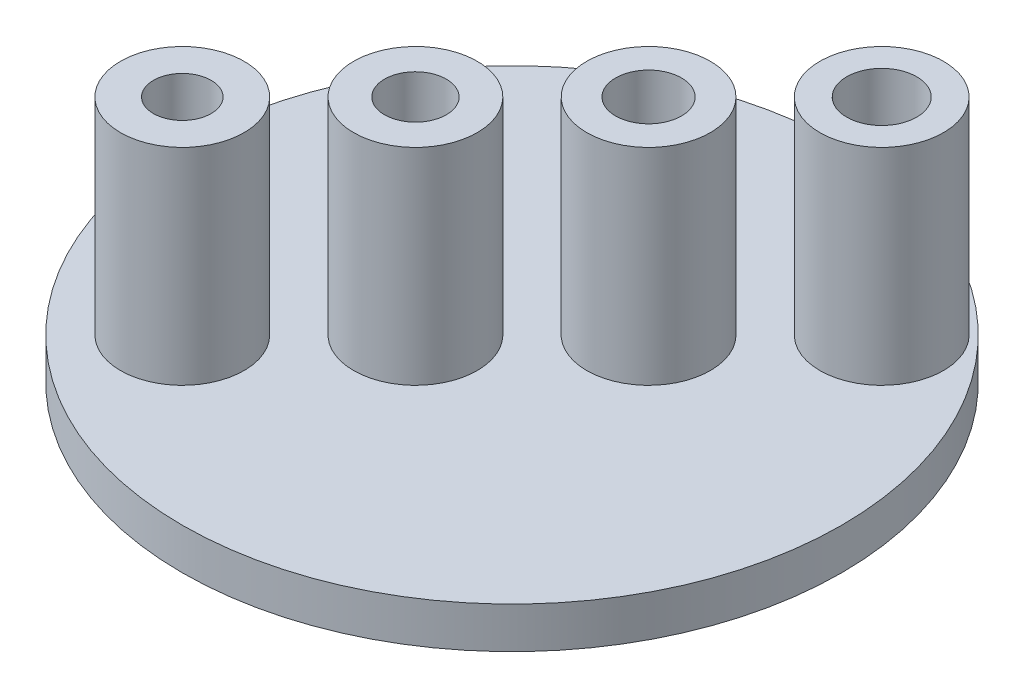
ISO-10303-21;
HEADER;
FILE_DESCRIPTION(('STEP AP214'),'2;1');
FILE_NAME('part.step','',(''),(''),'','','');
FILE_SCHEMA(('AUTOMOTIVE_DESIGN { 1 0 10303 214 1 1 1 1 }'));
ENDSEC;
DATA;
#1=APPLICATION_CONTEXT('core data for automotive mechanical design processes');
#2=APPLICATION_PROTOCOL_DEFINITION('international standard','automotive_design',2000,#1);
#3=PRODUCT_CONTEXT('',#1,'mechanical');
#4=PRODUCT('Part','Part','',(#3));
#5=PRODUCT_RELATED_PRODUCT_CATEGORY('part','',(#4));
#6=PRODUCT_DEFINITION_FORMATION('','',#4);
#7=PRODUCT_DEFINITION_CONTEXT('part definition',#1,'design');
#8=PRODUCT_DEFINITION('design','',#6,#7);
#9=PRODUCT_DEFINITION_SHAPE('','',#8);
#10=(LENGTH_UNIT() NAMED_UNIT(*) SI_UNIT(.MILLI.,.METRE.));
#11=(NAMED_UNIT(*) PLANE_ANGLE_UNIT() SI_UNIT($,.RADIAN.));
#12=(NAMED_UNIT(*) SI_UNIT($,.STERADIAN.) SOLID_ANGLE_UNIT());
#13=UNCERTAINTY_MEASURE_WITH_UNIT(LENGTH_MEASURE(1.E-05),#10,'distance_accuracy_value','');
#14=(GEOMETRIC_REPRESENTATION_CONTEXT(3) GLOBAL_UNCERTAINTY_ASSIGNED_CONTEXT((#13)) GLOBAL_UNIT_ASSIGNED_CONTEXT((#10,
#11,#12)) REPRESENTATION_CONTEXT('',''));
#15=CARTESIAN_POINT('',(0.,0.,0.));
#16=DIRECTION('',(0.,0.,1.));
#17=DIRECTION('',(1.,0.,0.));
#18=AXIS2_PLACEMENT_3D('',#15,#16,#17);
#19=CARTESIAN_POINT('',(0.,1.27,0.));
#20=DIRECTION('',(0.,-1.,0.));
#21=DIRECTION('',(0.,0.,-1.));
#22=AXIS2_PLACEMENT_3D('',#19,#20,#21);
#23=CYLINDRICAL_SURFACE('',#22,10.16);
#24=CARTESIAN_POINT('',(0.,1.27,0.));
#25=DIRECTION('',(0.,1.,0.));
#26=DIRECTION('',(0.,0.,1.));
#27=AXIS2_PLACEMENT_3D('',#24,#25,#26);
#28=CIRCLE('',#27,10.16);
#29=CARTESIAN_POINT('',(0.,1.27,10.16));
#30=VERTEX_POINT('',#29);
#31=EDGE_CURVE('E10',#30,#30,#28,.T.);
#32=ORIENTED_EDGE('',*,*,#31,.F.);
#33=EDGE_LOOP('',(#32));
#34=FACE_BOUND('',#33,.T.);
#35=CARTESIAN_POINT('',(0.,0.,0.));
#36=DIRECTION('',(0.,1.,0.));
#37=DIRECTION('',(0.,0.,1.));
#38=AXIS2_PLACEMENT_3D('',#35,#36,#37);
#39=CIRCLE('',#38,10.16);
#40=CARTESIAN_POINT('',(0.,0.,10.16));
#41=VERTEX_POINT('',#40);
#42=EDGE_CURVE('E42',#41,#41,#39,.T.);
#43=ORIENTED_EDGE('',*,*,#42,.T.);
#44=EDGE_LOOP('',(#43));
#45=FACE_BOUND('',#44,.T.);
#46=ADVANCED_FACE('F39',(#34,#45),#23,.T.);
#47=CARTESIAN_POINT('',(0.,1.27,0.));
#48=DIRECTION('',(0.,1.,0.));
#49=DIRECTION('',(0.,0.,1.));
#50=AXIS2_PLACEMENT_3D('',#47,#48,#49);
#51=PLANE('',#50);
#52=CARTESIAN_POINT('',(5.69630734528298,1.27,-5.69630734528298));
#53=DIRECTION('',(0.,1.,0.));
#54=DIRECTION('',(0.,0.,1.));
#55=AXIS2_PLACEMENT_3D('',#52,#53,#54);
#56=CIRCLE('',#55,1.905);
#57=CARTESIAN_POINT('',(5.69630734528298,1.27,-3.79130734528299));
#58=VERTEX_POINT('',#57);
#59=EDGE_CURVE('E69',#58,#58,#56,.T.);
#60=ORIENTED_EDGE('',*,*,#59,.F.);
#61=EDGE_LOOP('',(#60));
#62=FACE_BOUND('',#61,.T.);
#63=CARTESIAN_POINT('',(2.10420489685532,1.27,-2.10420489685532));
#64=DIRECTION('',(0.,1.,0.));
#65=DIRECTION('',(0.,0.,1.));
#66=AXIS2_PLACEMENT_3D('',#63,#64,#65);
#67=CIRCLE('',#66,1.905);
#68=CARTESIAN_POINT('',(2.10420489685532,1.27,-0.199204896855324));
#69=VERTEX_POINT('',#68);
#70=EDGE_CURVE('E63',#69,#69,#67,.T.);
#71=ORIENTED_EDGE('',*,*,#70,.F.);
#72=EDGE_LOOP('',(#71));
#73=FACE_BOUND('',#72,.T.);
#74=CARTESIAN_POINT('',(-1.48789755157234,1.27,1.48789755157234));
#75=DIRECTION('',(0.,1.,0.));
#76=DIRECTION('',(0.,0.,1.));
#77=AXIS2_PLACEMENT_3D('',#74,#75,#76);
#78=CIRCLE('',#77,1.905);
#79=CARTESIAN_POINT('',(-1.48789755157234,1.27,3.39289755157234));
#80=VERTEX_POINT('',#79);
#81=EDGE_CURVE('E57',#80,#80,#78,.T.);
#82=ORIENTED_EDGE('',*,*,#81,.F.);
#83=EDGE_LOOP('',(#82));
#84=FACE_BOUND('',#83,.T.);
#85=CARTESIAN_POINT('',(-5.08,1.27,5.08));
#86=DIRECTION('',(0.,1.,0.));
#87=DIRECTION('',(0.,0.,1.));
#88=AXIS2_PLACEMENT_3D('',#85,#86,#87);
#89=CIRCLE('',#88,1.905);
#90=CARTESIAN_POINT('',(-5.08,1.27,6.985));
#91=VERTEX_POINT('',#90);
#92=EDGE_CURVE('E51',#91,#91,#89,.T.);
#93=ORIENTED_EDGE('',*,*,#92,.F.);
#94=EDGE_LOOP('',(#93));
#95=FACE_BOUND('',#94,.T.);
#96=ORIENTED_EDGE('',*,*,#31,.T.);
#97=EDGE_LOOP('',(#96));
#98=FACE_BOUND('',#97,.T.);
#99=ADVANCED_FACE('F115',(#62,#73,#84,#95,#98),#51,.T.);
#100=CARTESIAN_POINT('',(0.,0.,0.));
#101=DIRECTION('',(0.,1.,0.));
#102=DIRECTION('',(0.,0.,1.));
#103=AXIS2_PLACEMENT_3D('',#100,#101,#102);
#104=PLANE('',#103);
#105=ORIENTED_EDGE('',*,*,#42,.F.);
#106=EDGE_LOOP('',(#105));
#107=FACE_BOUND('',#106,.T.);
#108=ADVANCED_FACE('F118',(#107),#104,.F.);
#109=CARTESIAN_POINT('',(-5.08,7.62,5.08));
#110=DIRECTION('',(0.,-1.,0.));
#111=DIRECTION('',(0.,0.,-1.));
#112=AXIS2_PLACEMENT_3D('',#109,#110,#111);
#113=CYLINDRICAL_SURFACE('',#112,1.905);
#114=CARTESIAN_POINT('',(-5.08,7.62,5.08));
#115=DIRECTION('',(0.,1.,0.));
#116=DIRECTION('',(0.,0.,1.));
#117=AXIS2_PLACEMENT_3D('',#114,#115,#116);
#118=CIRCLE('',#117,1.905);
#119=CARTESIAN_POINT('',(-5.08,7.62,6.985));
#120=VERTEX_POINT('',#119);
#121=EDGE_CURVE('E49',#120,#120,#118,.T.);
#122=ORIENTED_EDGE('',*,*,#121,.F.);
#123=EDGE_LOOP('',(#122));
#124=FACE_BOUND('',#123,.T.);
#125=ORIENTED_EDGE('',*,*,#92,.T.);
#126=EDGE_LOOP('',(#125));
#127=FACE_BOUND('',#126,.T.);
#128=ADVANCED_FACE('F126',(#124,#127),#113,.T.);
#129=CARTESIAN_POINT('',(-5.08,7.62,5.08));
#130=DIRECTION('',(0.,1.,0.));
#131=DIRECTION('',(0.,0.,1.));
#132=AXIS2_PLACEMENT_3D('',#129,#130,#131);
#133=PLANE('',#132);
#134=CARTESIAN_POINT('',(-5.08,7.62,5.08));
#135=DIRECTION('',(0.,1.,0.));
#136=DIRECTION('',(0.,0.,1.));
#137=AXIS2_PLACEMENT_3D('',#134,#135,#136);
#138=CIRCLE('',#137,0.889);
#139=CARTESIAN_POINT('',(-5.08,7.62,5.969));
#140=VERTEX_POINT('',#139);
#141=EDGE_CURVE('E77',#140,#140,#138,.T.);
#142=ORIENTED_EDGE('',*,*,#141,.F.);
#143=EDGE_LOOP('',(#142));
#144=FACE_BOUND('',#143,.T.);
#145=ORIENTED_EDGE('',*,*,#121,.T.);
#146=EDGE_LOOP('',(#145));
#147=FACE_BOUND('',#146,.T.);
#148=ADVANCED_FACE('F128',(#144,#147),#133,.T.);
#149=CARTESIAN_POINT('',(-1.48789755157234,7.62,1.48789755157234));
#150=DIRECTION('',(0.,-1.,0.));
#151=DIRECTION('',(0.,0.,-1.));
#152=AXIS2_PLACEMENT_3D('',#149,#150,#151);
#153=CYLINDRICAL_SURFACE('',#152,1.905);
#154=CARTESIAN_POINT('',(-1.48789755157234,7.62,1.48789755157234));
#155=DIRECTION('',(0.,1.,0.));
#156=DIRECTION('',(0.,0.,1.));
#157=AXIS2_PLACEMENT_3D('',#154,#155,#156);
#158=CIRCLE('',#157,1.905);
#159=CARTESIAN_POINT('',(-1.48789755157234,7.62,3.39289755157234));
#160=VERTEX_POINT('',#159);
#161=EDGE_CURVE('E54',#160,#160,#158,.T.);
#162=ORIENTED_EDGE('',*,*,#161,.F.);
#163=EDGE_LOOP('',(#162));
#164=FACE_BOUND('',#163,.T.);
#165=ORIENTED_EDGE('',*,*,#81,.T.);
#166=EDGE_LOOP('',(#165));
#167=FACE_BOUND('',#166,.T.);
#168=ADVANCED_FACE('F135',(#164,#167),#153,.T.);
#169=CARTESIAN_POINT('',(-1.48789755157234,7.62,1.48789755157234));
#170=DIRECTION('',(0.,1.,0.));
#171=DIRECTION('',(0.,0.,1.));
#172=AXIS2_PLACEMENT_3D('',#169,#170,#171);
#173=PLANE('',#172);
#174=CARTESIAN_POINT('',(-1.48789755157234,7.62,1.48789755157234));
#175=DIRECTION('',(0.,1.,0.));
#176=DIRECTION('',(0.,0.,1.));
#177=AXIS2_PLACEMENT_3D('',#174,#175,#176);
#178=CIRCLE('',#177,0.9525);
#179=CARTESIAN_POINT('',(-1.48789755157234,7.62,2.44039755157234));
#180=VERTEX_POINT('',#179);
#181=EDGE_CURVE('E83',#180,#180,#178,.T.);
#182=ORIENTED_EDGE('',*,*,#181,.F.);
#183=EDGE_LOOP('',(#182));
#184=FACE_BOUND('',#183,.T.);
#185=ORIENTED_EDGE('',*,*,#161,.T.);
#186=EDGE_LOOP('',(#185));
#187=FACE_BOUND('',#186,.T.);
#188=ADVANCED_FACE('F176',(#184,#187),#173,.T.);
#189=CARTESIAN_POINT('',(2.10420489685532,7.62,-2.10420489685532));
#190=DIRECTION('',(0.,-1.,0.));
#191=DIRECTION('',(0.,0.,-1.));
#192=AXIS2_PLACEMENT_3D('',#189,#190,#191);
#193=CYLINDRICAL_SURFACE('',#192,1.905);
#194=CARTESIAN_POINT('',(2.10420489685532,7.62,-2.10420489685532));
#195=DIRECTION('',(0.,1.,0.));
#196=DIRECTION('',(0.,0.,1.));
#197=AXIS2_PLACEMENT_3D('',#194,#195,#196);
#198=CIRCLE('',#197,1.905);
#199=CARTESIAN_POINT('',(2.10420489685532,7.62,-0.199204896855324));
#200=VERTEX_POINT('',#199);
#201=EDGE_CURVE('E60',#200,#200,#198,.T.);
#202=ORIENTED_EDGE('',*,*,#201,.F.);
#203=EDGE_LOOP('',(#202));
#204=FACE_BOUND('',#203,.T.);
#205=ORIENTED_EDGE('',*,*,#70,.T.);
#206=EDGE_LOOP('',(#205));
#207=FACE_BOUND('',#206,.T.);
#208=ADVANCED_FACE('F187',(#204,#207),#193,.T.);
#209=CARTESIAN_POINT('',(2.10420489685532,7.62,-2.10420489685532));
#210=DIRECTION('',(0.,1.,0.));
#211=DIRECTION('',(0.,0.,1.));
#212=AXIS2_PLACEMENT_3D('',#209,#210,#211);
#213=PLANE('',#212);
#214=CARTESIAN_POINT('',(2.10420489685532,7.62,-2.10420489685532));
#215=DIRECTION('',(0.,1.,0.));
#216=DIRECTION('',(0.,0.,1.));
#217=AXIS2_PLACEMENT_3D('',#214,#215,#216);
#218=CIRCLE('',#217,1.016);
#219=CARTESIAN_POINT('',(2.10420489685532,7.62,-1.08820489685532));
#220=VERTEX_POINT('',#219);
#221=EDGE_CURVE('E89',#220,#220,#218,.T.);
#222=ORIENTED_EDGE('',*,*,#221,.F.);
#223=EDGE_LOOP('',(#222));
#224=FACE_BOUND('',#223,.T.);
#225=ORIENTED_EDGE('',*,*,#201,.T.);
#226=EDGE_LOOP('',(#225));
#227=FACE_BOUND('',#226,.T.);
#228=ADVANCED_FACE('F111',(#224,#227),#213,.T.);
#229=CARTESIAN_POINT('',(5.69630734528298,7.62,-5.69630734528298));
#230=DIRECTION('',(0.,-1.,0.));
#231=DIRECTION('',(0.,0.,-1.));
#232=AXIS2_PLACEMENT_3D('',#229,#230,#231);
#233=CYLINDRICAL_SURFACE('',#232,1.905);
#234=CARTESIAN_POINT('',(5.69630734528298,7.62,-5.69630734528298));
#235=DIRECTION('',(0.,1.,0.));
#236=DIRECTION('',(0.,0.,1.));
#237=AXIS2_PLACEMENT_3D('',#234,#235,#236);
#238=CIRCLE('',#237,1.905);
#239=CARTESIAN_POINT('',(5.69630734528298,7.62,-3.79130734528299));
#240=VERTEX_POINT('',#239);
#241=EDGE_CURVE('E66',#240,#240,#238,.T.);
#242=ORIENTED_EDGE('',*,*,#241,.F.);
#243=EDGE_LOOP('',(#242));
#244=FACE_BOUND('',#243,.T.);
#245=ORIENTED_EDGE('',*,*,#59,.T.);
#246=EDGE_LOOP('',(#245));
#247=FACE_BOUND('',#246,.T.);
#248=ADVANCED_FACE('F105',(#244,#247),#233,.T.);
#249=CARTESIAN_POINT('',(5.69630734528298,7.62,-5.69630734528298));
#250=DIRECTION('',(0.,1.,0.));
#251=DIRECTION('',(0.,0.,1.));
#252=AXIS2_PLACEMENT_3D('',#249,#250,#251);
#253=PLANE('',#252);
#254=CARTESIAN_POINT('',(5.69630734528298,7.62,-5.69630734528298));
#255=DIRECTION('',(0.,1.,0.));
#256=DIRECTION('',(0.,0.,1.));
#257=AXIS2_PLACEMENT_3D('',#254,#255,#256);
#258=CIRCLE('',#257,1.0795);
#259=CARTESIAN_POINT('',(5.69630734528298,7.62,-4.61680734528298));
#260=VERTEX_POINT('',#259);
#261=EDGE_CURVE('E95',#260,#260,#258,.T.);
#262=ORIENTED_EDGE('',*,*,#261,.F.);
#263=EDGE_LOOP('',(#262));
#264=FACE_BOUND('',#263,.T.);
#265=ORIENTED_EDGE('',*,*,#241,.T.);
#266=EDGE_LOOP('',(#265));
#267=FACE_BOUND('',#266,.T.);
#268=ADVANCED_FACE('F101',(#264,#267),#253,.T.);
#269=CARTESIAN_POINT('',(-5.08,-1.24447171389936,5.08));
#270=DIRECTION('',(0.,1.,0.));
#271=DIRECTION('',(0.,0.,1.));
#272=AXIS2_PLACEMENT_3D('',#269,#270,#271);
#273=CYLINDRICAL_SURFACE('',#272,0.889);
#274=CARTESIAN_POINT('',(-5.08,1.27,5.08));
#275=DIRECTION('',(0.,1.,0.));
#276=DIRECTION('',(0.,0.,1.));
#277=AXIS2_PLACEMENT_3D('',#274,#275,#276);
#278=CIRCLE('',#277,0.889);
#279=CARTESIAN_POINT('',(-5.08,1.27,5.969));
#280=VERTEX_POINT('',#279);
#281=EDGE_CURVE('E72',#280,#280,#278,.F.);
#282=ORIENTED_EDGE('',*,*,#281,.T.);
#283=EDGE_LOOP('',(#282));
#284=FACE_BOUND('',#283,.T.);
#285=ORIENTED_EDGE('',*,*,#141,.T.);
#286=EDGE_LOOP('',(#285));
#287=FACE_BOUND('',#286,.T.);
#288=ADVANCED_FACE('F104',(#284,#287),#273,.F.);
#289=CARTESIAN_POINT('',(0.,1.27,0.));
#290=DIRECTION('',(0.,1.,0.));
#291=DIRECTION('',(0.,0.,1.));
#292=AXIS2_PLACEMENT_3D('',#289,#290,#291);
#293=PLANE('',#292);
#294=ORIENTED_EDGE('',*,*,#281,.F.);
#295=EDGE_LOOP('',(#294));
#296=FACE_BOUND('',#295,.T.);
#297=ADVANCED_FACE('F231',(#296),#293,.T.);
#298=CARTESIAN_POINT('',(-1.48789755157234,-1.42407683632074,1.48789755157234));
#299=DIRECTION('',(0.,1.,0.));
#300=DIRECTION('',(0.,0.,1.));
#301=AXIS2_PLACEMENT_3D('',#298,#299,#300);
#302=CYLINDRICAL_SURFACE('',#301,0.9525);
#303=CARTESIAN_POINT('',(-1.48789755157234,1.27,1.48789755157234));
#304=DIRECTION('',(0.,1.,0.));
#305=DIRECTION('',(0.,0.,1.));
#306=AXIS2_PLACEMENT_3D('',#303,#304,#305);
#307=CIRCLE('',#306,0.9525);
#308=CARTESIAN_POINT('',(-1.48789755157234,1.27,2.44039755157234));
#309=VERTEX_POINT('',#308);
#310=EDGE_CURVE('E80',#309,#309,#307,.F.);
#311=ORIENTED_EDGE('',*,*,#310,.T.);
#312=EDGE_LOOP('',(#311));
#313=FACE_BOUND('',#312,.T.);
#314=ORIENTED_EDGE('',*,*,#181,.T.);
#315=EDGE_LOOP('',(#314));
#316=FACE_BOUND('',#315,.T.);
#317=ADVANCED_FACE('F240',(#313,#316),#302,.F.);
#318=CARTESIAN_POINT('',(0.,1.27,0.));
#319=DIRECTION('',(0.,1.,0.));
#320=DIRECTION('',(0.,0.,1.));
#321=AXIS2_PLACEMENT_3D('',#318,#319,#320);
#322=PLANE('',#321);
#323=ORIENTED_EDGE('',*,*,#310,.F.);
#324=EDGE_LOOP('',(#323));
#325=FACE_BOUND('',#324,.T.);
#326=ADVANCED_FACE('F249',(#325),#322,.T.);
#327=CARTESIAN_POINT('',(2.10420489685532,-1.60368195874213,-2.10420489685532));
#328=DIRECTION('',(0.,1.,0.));
#329=DIRECTION('',(0.,0.,1.));
#330=AXIS2_PLACEMENT_3D('',#327,#328,#329);
#331=CYLINDRICAL_SURFACE('',#330,1.016);
#332=CARTESIAN_POINT('',(2.10420489685532,1.27,-2.10420489685532));
#333=DIRECTION('',(0.,1.,0.));
#334=DIRECTION('',(0.,0.,1.));
#335=AXIS2_PLACEMENT_3D('',#332,#333,#334);
#336=CIRCLE('',#335,1.016);
#337=CARTESIAN_POINT('',(2.10420489685532,1.27,-1.08820489685532));
#338=VERTEX_POINT('',#337);
#339=EDGE_CURVE('E86',#338,#338,#336,.F.);
#340=CARTESIAN_POINT('',(2.10420489685532,1.27,-1.08820489685532));
#341=CARTESIAN_POINT('',(2.10420489685532,1.33614583333333,-1.08820489685532));
#342=CARTESIAN_POINT('',(2.10420489685532,1.40229166666667,-1.08820489685532));
#343=CARTESIAN_POINT('',(2.10420489685532,1.53458333333333,-1.08820489685532));
#344=CARTESIAN_POINT('',(2.10420489685532,1.60072916666667,-1.08820489685532));
#345=CARTESIAN_POINT('',(2.10420489685532,1.73302083333333,-1.08820489685532));
#346=CARTESIAN_POINT('',(2.10420489685532,1.79916666666667,-1.08820489685532));
#347=CARTESIAN_POINT('',(2.10420489685532,1.93145833333333,-1.08820489685532));
#348=CARTESIAN_POINT('',(2.10420489685532,1.99760416666667,-1.08820489685532));
#349=CARTESIAN_POINT('',(2.10420489685532,2.12989583333333,-1.08820489685532));
#350=CARTESIAN_POINT('',(2.10420489685532,2.19604166666667,-1.08820489685532));
#351=CARTESIAN_POINT('',(2.10420489685532,2.32833333333333,-1.08820489685532));
#352=CARTESIAN_POINT('',(2.10420489685532,2.39447916666667,-1.08820489685532));
#353=CARTESIAN_POINT('',(2.10420489685532,2.52677083333333,-1.08820489685532));
#354=CARTESIAN_POINT('',(2.10420489685532,2.59291666666667,-1.08820489685532));
#355=CARTESIAN_POINT('',(2.10420489685532,2.72520833333333,-1.08820489685532));
#356=CARTESIAN_POINT('',(2.10420489685532,2.79135416666667,-1.08820489685532));
#357=CARTESIAN_POINT('',(2.10420489685532,2.92364583333333,-1.08820489685532));
#358=CARTESIAN_POINT('',(2.10420489685532,2.98979166666667,-1.08820489685532));
#359=CARTESIAN_POINT('',(2.10420489685532,3.12208333333333,-1.08820489685532));
#360=CARTESIAN_POINT('',(2.10420489685532,3.18822916666667,-1.08820489685532));
#361=CARTESIAN_POINT('',(2.10420489685532,3.32052083333333,-1.08820489685532));
#362=CARTESIAN_POINT('',(2.10420489685532,3.38666666666667,-1.08820489685532));
#363=CARTESIAN_POINT('',(2.10420489685532,3.51895833333333,-1.08820489685532));
#364=CARTESIAN_POINT('',(2.10420489685532,3.58510416666667,-1.08820489685532));
#365=CARTESIAN_POINT('',(2.10420489685532,3.71739583333333,-1.08820489685532));
#366=CARTESIAN_POINT('',(2.10420489685532,3.78354166666667,-1.08820489685532));
#367=CARTESIAN_POINT('',(2.10420489685532,3.91583333333333,-1.08820489685532));
#368=CARTESIAN_POINT('',(2.10420489685532,3.98197916666667,-1.08820489685532));
#369=CARTESIAN_POINT('',(2.10420489685532,4.11427083333333,-1.08820489685532));
#370=CARTESIAN_POINT('',(2.10420489685532,4.18041666666667,-1.08820489685532));
#371=CARTESIAN_POINT('',(2.10420489685532,4.31270833333333,-1.08820489685532));
#372=CARTESIAN_POINT('',(2.10420489685532,4.37885416666667,-1.08820489685532));
#373=CARTESIAN_POINT('',(2.10420489685532,4.51114583333333,-1.08820489685532));
#374=CARTESIAN_POINT('',(2.10420489685532,4.57729166666667,-1.08820489685532));
#375=CARTESIAN_POINT('',(2.10420489685532,4.70958333333333,-1.08820489685532));
#376=CARTESIAN_POINT('',(2.10420489685532,4.77572916666667,-1.08820489685532));
#377=CARTESIAN_POINT('',(2.10420489685532,4.90802083333333,-1.08820489685532));
#378=CARTESIAN_POINT('',(2.10420489685532,4.97416666666667,-1.08820489685532));
#379=CARTESIAN_POINT('',(2.10420489685532,5.10645833333333,-1.08820489685532));
#380=CARTESIAN_POINT('',(2.10420489685532,5.17260416666667,-1.08820489685532));
#381=CARTESIAN_POINT('',(2.10420489685532,5.30489583333333,-1.08820489685532));
#382=CARTESIAN_POINT('',(2.10420489685532,5.37104166666667,-1.08820489685532));
#383=CARTESIAN_POINT('',(2.10420489685532,5.50333333333333,-1.08820489685532));
#384=CARTESIAN_POINT('',(2.10420489685532,5.56947916666667,-1.08820489685532));
#385=CARTESIAN_POINT('',(2.10420489685532,5.70177083333333,-1.08820489685532));
#386=CARTESIAN_POINT('',(2.10420489685532,5.76791666666667,-1.08820489685532));
#387=CARTESIAN_POINT('',(2.10420489685532,5.90020833333333,-1.08820489685532));
#388=CARTESIAN_POINT('',(2.10420489685532,5.96635416666667,-1.08820489685532));
#389=CARTESIAN_POINT('',(2.10420489685532,6.09864583333333,-1.08820489685532));
#390=CARTESIAN_POINT('',(2.10420489685532,6.16479166666667,-1.08820489685532));
#391=CARTESIAN_POINT('',(2.10420489685532,6.29708333333333,-1.08820489685532));
#392=CARTESIAN_POINT('',(2.10420489685532,6.36322916666667,-1.08820489685532));
#393=CARTESIAN_POINT('',(2.10420489685532,6.49552083333333,-1.08820489685532));
#394=CARTESIAN_POINT('',(2.10420489685532,6.56166666666667,-1.08820489685532));
#395=CARTESIAN_POINT('',(2.10420489685532,6.69395833333333,-1.08820489685532));
#396=CARTESIAN_POINT('',(2.10420489685532,6.76010416666667,-1.08820489685532));
#397=CARTESIAN_POINT('',(2.10420489685532,6.89239583333333,-1.08820489685532));
#398=CARTESIAN_POINT('',(2.10420489685532,6.95854166666667,-1.08820489685532));
#399=CARTESIAN_POINT('',(2.10420489685532,7.09083333333333,-1.08820489685532));
#400=CARTESIAN_POINT('',(2.10420489685532,7.15697916666667,-1.08820489685532));
#401=CARTESIAN_POINT('',(2.10420489685532,7.28927083333333,-1.08820489685532));
#402=CARTESIAN_POINT('',(2.10420489685532,7.35541666666667,-1.08820489685532));
#403=CARTESIAN_POINT('',(2.10420489685532,7.48770833333333,-1.08820489685532));
#404=CARTESIAN_POINT('',(2.10420489685532,7.55385416666667,-1.08820489685532));
#405=CARTESIAN_POINT('',(2.10420489685532,7.62,-1.08820489685532));
#406=B_SPLINE_CURVE_WITH_KNOTS('',3,(#340,#341,#342,#343,#344,#345,#346,#347,#348,#349,#350,
#351,#352,#353,#354,#355,#356,#357,#358,#359,#360,#361,#362,#363,#364,#365,#366,#367,#368,#369,
#370,#371,#372,#373,#374,#375,#376,#377,#378,#379,#380,#381,#382,#383,#384,#385,#386,#387,#388,
#389,#390,#391,#392,#393,#394,#395,#396,#397,#398,#399,#400,#401,#402,#403,#404,#405),
.UNSPECIFIED.,.F.,.F.,(4,2,2,2,2,2,2,2,2,2,2,2,2,2,2,2,2,2,2,2,2,2,2,2,2,2,2,2,2,2,2,2,4),(0.,
0.1984375,0.396875,0.5953125,0.79375,0.9921875,1.190625,1.3890625,1.5875,1.7859375,1.984375,
2.1828125,2.38125,2.5796875,2.778125,2.9765625,3.175,3.3734375,3.571875,3.7703125,3.96875,
4.1671875,4.365625,4.5640625,4.7625,4.9609375,5.159375,5.3578125,5.55625,5.7546875,5.953125,
6.1515625,6.35),.UNSPECIFIED.);
#407=EDGE_CURVE('BSEAM258',#338,#220,#406,.T.);
#408=ORIENTED_EDGE('',*,*,#339,.T.);
#409=ORIENTED_EDGE('',*,*,#221,.T.);
#410=ORIENTED_EDGE('',*,*,#407,.T.);
#411=ORIENTED_EDGE('',*,*,#407,.F.);
#412=EDGE_LOOP('',(#408,#410,#409,#411));
#413=FACE_BOUND('',#412,.T.);
#414=ADVANCED_FACE('F258',(#413),#331,.F.);
#415=CARTESIAN_POINT('',(0.,1.27,0.));
#416=DIRECTION('',(0.,1.,0.));
#417=DIRECTION('',(0.,0.,1.));
#418=AXIS2_PLACEMENT_3D('',#415,#416,#417);
#419=PLANE('',#418);
#420=ORIENTED_EDGE('',*,*,#339,.F.);
#421=EDGE_LOOP('',(#420));
#422=FACE_BOUND('',#421,.T.);
#423=ADVANCED_FACE('F267',(#422),#419,.T.);
#424=CARTESIAN_POINT('',(5.69630734528298,-1.78328708116351,-5.69630734528298));
#425=DIRECTION('',(0.,1.,0.));
#426=DIRECTION('',(0.,0.,1.));
#427=AXIS2_PLACEMENT_3D('',#424,#425,#426);
#428=CYLINDRICAL_SURFACE('',#427,1.0795);
#429=CARTESIAN_POINT('',(5.69630734528298,1.27,-5.69630734528298));
#430=DIRECTION('',(0.,1.,0.));
#431=DIRECTION('',(0.,0.,1.));
#432=AXIS2_PLACEMENT_3D('',#429,#430,#431);
#433=CIRCLE('',#432,1.0795);
#434=CARTESIAN_POINT('',(5.69630734528298,1.27,-4.61680734528298));
#435=VERTEX_POINT('',#434);
#436=EDGE_CURVE('E92',#435,#435,#433,.F.);
#437=ORIENTED_EDGE('',*,*,#436,.T.);
#438=EDGE_LOOP('',(#437));
#439=FACE_BOUND('',#438,.T.);
#440=ORIENTED_EDGE('',*,*,#261,.T.);
#441=EDGE_LOOP('',(#440));
#442=FACE_BOUND('',#441,.T.);
#443=ADVANCED_FACE('F99',(#439,#442),#428,.F.);
#444=CARTESIAN_POINT('',(0.,1.27,0.));
#445=DIRECTION('',(0.,1.,0.));
#446=DIRECTION('',(0.,0.,1.));
#447=AXIS2_PLACEMENT_3D('',#444,#445,#446);
#448=PLANE('',#447);
#449=ORIENTED_EDGE('',*,*,#436,.F.);
#450=EDGE_LOOP('',(#449));
#451=FACE_BOUND('',#450,.T.);
#452=ADVANCED_FACE('F284',(#451),#448,.T.);
#453=CLOSED_SHELL('',(#46,#99,#108,#128,#148,#168,#188,#208,#228,#248,#268,#288,#297,#317,#326,
#414,#423,#443,#452));
#454=MANIFOLD_SOLID_BREP('B2',#453);
#455=ADVANCED_BREP_SHAPE_REPRESENTATION('',(#18,#454),#14);
#456=SHAPE_DEFINITION_REPRESENTATION(#9,#455);
ENDSEC;
END-ISO-10303-21;
